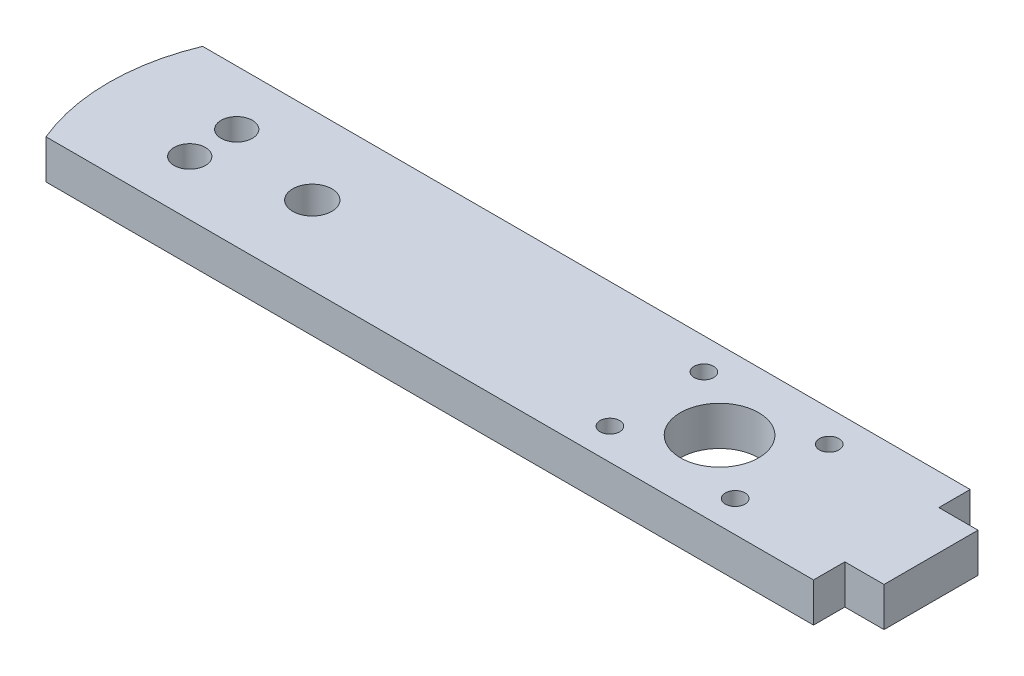
ISO-10303-21;
HEADER;
FILE_DESCRIPTION(('STEP AP214'),'2;1');
FILE_NAME('part.step','',(''),(''),'','','');
FILE_SCHEMA(('AUTOMOTIVE_DESIGN { 1 0 10303 214 1 1 1 1 }'));
ENDSEC;
DATA;
#1=APPLICATION_CONTEXT('core data for automotive mechanical design processes');
#2=APPLICATION_PROTOCOL_DEFINITION('international standard','automotive_design',2000,#1);
#3=PRODUCT_CONTEXT('',#1,'mechanical');
#4=PRODUCT('Part','Part','',(#3));
#5=PRODUCT_RELATED_PRODUCT_CATEGORY('part','',(#4));
#6=PRODUCT_DEFINITION_FORMATION('','',#4);
#7=PRODUCT_DEFINITION_CONTEXT('part definition',#1,'design');
#8=PRODUCT_DEFINITION('design','',#6,#7);
#9=PRODUCT_DEFINITION_SHAPE('','',#8);
#10=(LENGTH_UNIT() NAMED_UNIT(*) SI_UNIT(.MILLI.,.METRE.));
#11=(NAMED_UNIT(*) PLANE_ANGLE_UNIT() SI_UNIT($,.RADIAN.));
#12=(NAMED_UNIT(*) SI_UNIT($,.STERADIAN.) SOLID_ANGLE_UNIT());
#13=UNCERTAINTY_MEASURE_WITH_UNIT(LENGTH_MEASURE(1.E-05),#10,'distance_accuracy_value','');
#14=(GEOMETRIC_REPRESENTATION_CONTEXT(3) GLOBAL_UNCERTAINTY_ASSIGNED_CONTEXT((#13)) GLOBAL_UNIT_ASSIGNED_CONTEXT((#10,
#11,#12)) REPRESENTATION_CONTEXT('',''));
#15=CARTESIAN_POINT('',(0.,0.,0.));
#16=DIRECTION('',(0.,0.,1.));
#17=DIRECTION('',(1.,0.,0.));
#18=AXIS2_PLACEMENT_3D('',#15,#16,#17);
#19=CARTESIAN_POINT('',(-70.,2.5,9.99999999999979));
#20=DIRECTION('',(0.,0.,-1.));
#21=DIRECTION('',(-1.,0.,0.));
#22=AXIS2_PLACEMENT_3D('',#19,#20,#21);
#23=PLANE('',#22);
#24=DIRECTION('',(0.,1.,0.));
#25=VECTOR('',#24,1.);
#26=CARTESIAN_POINT('',(-28.0000000000001,-7.5,9.99999999999979));
#27=LINE('',#26,#25);
#28=CARTESIAN_POINT('',(-28.0000000000001,-2.5,9.99999999999979));
#29=VERTEX_POINT('',#28);
#30=CARTESIAN_POINT('',(-28.0000000000001,2.5,9.99999999999979));
#31=VERTEX_POINT('',#30);
#32=EDGE_CURVE('E75',#29,#31,#27,.T.);
#33=ORIENTED_EDGE('',*,*,#32,.F.);
#34=DIRECTION('',(1.,0.,0.));
#35=VECTOR('',#34,1.);
#36=CARTESIAN_POINT('',(-70.,-2.5,9.99999999999979));
#37=LINE('',#36,#35);
#38=CARTESIAN_POINT('',(70.,-2.5,9.99999999999979));
#39=VERTEX_POINT('',#38);
#40=EDGE_CURVE('E146',#29,#39,#37,.T.);
#41=ORIENTED_EDGE('',*,*,#40,.T.);
#42=DIRECTION('',(0.,-1.,0.));
#43=VECTOR('',#42,1.);
#44=CARTESIAN_POINT('',(70.,2.5,9.99999999999979));
#45=LINE('',#44,#43);
#46=CARTESIAN_POINT('',(70.,2.5,9.99999999999979));
#47=VERTEX_POINT('',#46);
#48=EDGE_CURVE('E134',#47,#39,#45,.T.);
#49=ORIENTED_EDGE('',*,*,#48,.F.);
#50=DIRECTION('',(1.,0.,0.));
#51=VECTOR('',#50,1.);
#52=CARTESIAN_POINT('',(-70.,2.5,9.99999999999979));
#53=LINE('',#52,#51);
#54=EDGE_CURVE('E142',#31,#47,#53,.T.);
#55=ORIENTED_EDGE('',*,*,#54,.F.);
#56=EDGE_LOOP('',(#33,#41,#49,#55));
#57=FACE_BOUND('',#56,.T.);
#58=ADVANCED_FACE('F60',(#57),#23,.F.);
#59=CARTESIAN_POINT('',(-70.,2.5,-9.99999999999979));
#60=DIRECTION('',(0.,0.,-1.));
#61=DIRECTION('',(-1.,0.,0.));
#62=AXIS2_PLACEMENT_3D('',#59,#60,#61);
#63=PLANE('',#62);
#64=DIRECTION('',(1.,0.,0.));
#65=VECTOR('',#64,1.);
#66=CARTESIAN_POINT('',(-70.,-2.5,-9.99999999999979));
#67=LINE('',#66,#65);
#68=CARTESIAN_POINT('',(-28.0000000000001,-2.5,-9.99999999999979));
#69=VERTEX_POINT('',#68);
#70=CARTESIAN_POINT('',(70.,-2.5,-9.99999999999979));
#71=VERTEX_POINT('',#70);
#72=EDGE_CURVE('E135',#69,#71,#67,.T.);
#73=ORIENTED_EDGE('',*,*,#72,.F.);
#74=DIRECTION('',(0.,1.,0.));
#75=VECTOR('',#74,1.);
#76=CARTESIAN_POINT('',(-28.0000000000001,-7.5,-9.99999999999979));
#77=LINE('',#76,#75);
#78=CARTESIAN_POINT('',(-28.0000000000001,2.5,-9.99999999999979));
#79=VERTEX_POINT('',#78);
#80=EDGE_CURVE('E571',#69,#79,#77,.T.);
#81=ORIENTED_EDGE('',*,*,#80,.T.);
#82=DIRECTION('',(1.,0.,0.));
#83=VECTOR('',#82,1.);
#84=CARTESIAN_POINT('',(-70.,2.5,-9.99999999999979));
#85=LINE('',#84,#83);
#86=CARTESIAN_POINT('',(70.,2.5,-9.99999999999979));
#87=VERTEX_POINT('',#86);
#88=EDGE_CURVE('E149',#79,#87,#85,.T.);
#89=ORIENTED_EDGE('',*,*,#88,.T.);
#90=DIRECTION('',(0.,-1.,0.));
#91=VECTOR('',#90,1.);
#92=CARTESIAN_POINT('',(70.,2.5,-9.99999999999979));
#93=LINE('',#92,#91);
#94=EDGE_CURVE('E152',#87,#71,#93,.T.);
#95=ORIENTED_EDGE('',*,*,#94,.T.);
#96=EDGE_LOOP('',(#73,#81,#89,#95));
#97=FACE_BOUND('',#96,.T.);
#98=ADVANCED_FACE('F189',(#97),#63,.T.);
#99=CARTESIAN_POINT('',(0.,-2.5,0.));
#100=DIRECTION('',(0.,-1.,0.));
#101=DIRECTION('',(0.,0.,-1.));
#102=AXIS2_PLACEMENT_3D('',#99,#100,#101);
#103=PLANE('',#102);
#104=CARTESIAN_POINT('',(-16.6491106406735,-2.5,3.));
#105=DIRECTION('',(0.,1.,0.));
#106=DIRECTION('',(0.,0.,1.));
#107=AXIS2_PLACEMENT_3D('',#104,#105,#106);
#108=CIRCLE('',#107,1.5);
#109=CARTESIAN_POINT('',(-16.6491106406735,-2.5,4.5));
#110=VERTEX_POINT('',#109);
#111=EDGE_CURVE('E470',#110,#110,#108,.T.);
#112=ORIENTED_EDGE('',*,*,#111,.T.);
#113=EDGE_LOOP('',(#112));
#114=FACE_BOUND('',#113,.T.);
#115=CARTESIAN_POINT('',(-16.6491106406735,-2.5,-3.));
#116=DIRECTION('',(0.,1.,0.));
#117=DIRECTION('',(0.,0.,1.));
#118=AXIS2_PLACEMENT_3D('',#115,#116,#117);
#119=CIRCLE('',#118,1.5);
#120=CARTESIAN_POINT('',(-16.6491106406735,-2.5,-1.5));
#121=VERTEX_POINT('',#120);
#122=EDGE_CURVE('E482',#121,#121,#119,.T.);
#123=ORIENTED_EDGE('',*,*,#122,.T.);
#124=EDGE_LOOP('',(#123));
#125=FACE_BOUND('',#124,.T.);
#126=CARTESIAN_POINT('',(-3.99999999999999,-2.5,0.));
#127=DIRECTION('',(0.,-1.,0.));
#128=DIRECTION('',(0.,0.,-1.));
#129=AXIS2_PLACEMENT_3D('',#126,#127,#128);
#130=CIRCLE('',#129,2.49999999999999);
#131=CARTESIAN_POINT('',(-3.99999999999999,-2.5,-2.49999999999999));
#132=VERTEX_POINT('',#131);
#133=EDGE_CURVE('E485',#132,#132,#130,.T.);
#134=ORIENTED_EDGE('',*,*,#133,.F.);
#135=EDGE_LOOP('',(#134));
#136=FACE_BOUND('',#135,.T.);
#137=CARTESIAN_POINT('',(56.,-2.5,-5.99999999999998));
#138=DIRECTION('',(0.,-1.,0.));
#139=DIRECTION('',(0.,0.,-1.));
#140=AXIS2_PLACEMENT_3D('',#137,#138,#139);
#141=CIRCLE('',#140,1.525);
#142=CARTESIAN_POINT('',(56.,-2.5,-7.52499999999998));
#143=VERTEX_POINT('',#142);
#144=EDGE_CURVE('E491',#143,#143,#141,.T.);
#145=ORIENTED_EDGE('',*,*,#144,.F.);
#146=EDGE_LOOP('',(#145));
#147=FACE_BOUND('',#146,.T.);
#148=CARTESIAN_POINT('',(40.,-2.5,-5.99999999999998));
#149=DIRECTION('',(0.,-1.,0.));
#150=DIRECTION('',(0.,0.,-1.));
#151=AXIS2_PLACEMENT_3D('',#148,#149,#150);
#152=CIRCLE('',#151,1.525);
#153=CARTESIAN_POINT('',(40.,-2.5,-7.52499999999998));
#154=VERTEX_POINT('',#153);
#155=EDGE_CURVE('E500',#154,#154,#152,.T.);
#156=ORIENTED_EDGE('',*,*,#155,.F.);
#157=EDGE_LOOP('',(#156));
#158=FACE_BOUND('',#157,.T.);
#159=CARTESIAN_POINT('',(40.,-2.5,5.99999999999998));
#160=DIRECTION('',(0.,-1.,0.));
#161=DIRECTION('',(0.,0.,-1.));
#162=AXIS2_PLACEMENT_3D('',#159,#160,#161);
#163=CIRCLE('',#162,1.525);
#164=CARTESIAN_POINT('',(40.,-2.5,4.47499999999999));
#165=VERTEX_POINT('',#164);
#166=EDGE_CURVE('E509',#165,#165,#163,.T.);
#167=ORIENTED_EDGE('',*,*,#166,.F.);
#168=EDGE_LOOP('',(#167));
#169=FACE_BOUND('',#168,.T.);
#170=CARTESIAN_POINT('',(56.,-2.5,5.99999999999998));
#171=DIRECTION('',(0.,-1.,0.));
#172=DIRECTION('',(0.,0.,-1.));
#173=AXIS2_PLACEMENT_3D('',#170,#171,#172);
#174=CIRCLE('',#173,1.525);
#175=CARTESIAN_POINT('',(56.,-2.5,4.47499999999999));
#176=VERTEX_POINT('',#175);
#177=EDGE_CURVE('E518',#176,#176,#174,.T.);
#178=ORIENTED_EDGE('',*,*,#177,.F.);
#179=EDGE_LOOP('',(#178));
#180=FACE_BOUND('',#179,.T.);
#181=CARTESIAN_POINT('',(48.,-2.5,0.));
#182=DIRECTION('',(0.,-1.,0.));
#183=DIRECTION('',(0.,0.,-1.));
#184=AXIS2_PLACEMENT_3D('',#181,#182,#183);
#185=CIRCLE('',#184,5.);
#186=CARTESIAN_POINT('',(48.,-2.5,-5.));
#187=VERTEX_POINT('',#186);
#188=EDGE_CURVE('E159',#187,#187,#185,.T.);
#189=ORIENTED_EDGE('',*,*,#188,.F.);
#190=EDGE_LOOP('',(#189));
#191=FACE_BOUND('',#190,.T.);
#192=ORIENTED_EDGE('',*,*,#40,.F.);
#193=CARTESIAN_POINT('',(-3.99999999999999,-2.5,0.));
#194=DIRECTION('',(0.,-1.,0.));
#195=DIRECTION('',(0.,0.,-1.));
#196=AXIS2_PLACEMENT_3D('',#193,#194,#195);
#197=CIRCLE('',#196,26.);
#198=EDGE_CURVE('E461',#29,#69,#197,.T.);
#199=ORIENTED_EDGE('',*,*,#198,.T.);
#200=ORIENTED_EDGE('',*,*,#72,.T.);
#201=DIRECTION('',(0.,0.,-1.));
#202=VECTOR('',#201,1.);
#203=CARTESIAN_POINT('',(70.,-2.5,9.99999999999979));
#204=LINE('',#203,#202);
#205=CARTESIAN_POINT('',(70.,-2.5,-5.99999999999998));
#206=VERTEX_POINT('',#205);
#207=EDGE_CURVE('E127',#206,#71,#204,.T.);
#208=ORIENTED_EDGE('',*,*,#207,.F.);
#209=DIRECTION('',(1.,0.,0.));
#210=VECTOR('',#209,1.);
#211=CARTESIAN_POINT('',(70.,-2.5,-5.99999999999998));
#212=LINE('',#211,#210);
#213=CARTESIAN_POINT('',(75.,-2.5,-6.00000000000001));
#214=VERTEX_POINT('',#213);
#215=EDGE_CURVE('E106',#206,#214,#212,.T.);
#216=ORIENTED_EDGE('',*,*,#215,.T.);
#217=DIRECTION('',(0.,0.,1.));
#218=VECTOR('',#217,1.);
#219=CARTESIAN_POINT('',(75.,-2.5,-6.00000000000001));
#220=LINE('',#219,#218);
#221=CARTESIAN_POINT('',(75.,-2.5,5.99999999999998));
#222=VERTEX_POINT('',#221);
#223=EDGE_CURVE('E115',#214,#222,#220,.T.);
#224=ORIENTED_EDGE('',*,*,#223,.T.);
#225=DIRECTION('',(1.,0.,0.));
#226=VECTOR('',#225,1.);
#227=CARTESIAN_POINT('',(70.,-2.5,5.99999999999998));
#228=LINE('',#227,#226);
#229=CARTESIAN_POINT('',(70.,-2.5,5.99999999999998));
#230=VERTEX_POINT('',#229);
#231=EDGE_CURVE('E121',#230,#222,#228,.T.);
#232=ORIENTED_EDGE('',*,*,#231,.F.);
#233=EDGE_CURVE('E139',#39,#230,#204,.T.);
#234=ORIENTED_EDGE('',*,*,#233,.F.);
#235=EDGE_LOOP('',(#192,#199,#200,#208,#216,#224,#232,#234));
#236=FACE_BOUND('',#235,.T.);
#237=ADVANCED_FACE('F124',(#114,#125,#136,#147,#158,#169,#180,#191,#236),#103,.T.);
#238=CARTESIAN_POINT('',(0.,2.5,0.));
#239=DIRECTION('',(0.,-1.,0.));
#240=DIRECTION('',(0.,0.,-1.));
#241=AXIS2_PLACEMENT_3D('',#238,#239,#240);
#242=PLANE('',#241);
#243=CARTESIAN_POINT('',(48.,2.5,0.));
#244=DIRECTION('',(0.,-1.,0.));
#245=DIRECTION('',(0.,0.,-1.));
#246=AXIS2_PLACEMENT_3D('',#243,#244,#245);
#247=CIRCLE('',#246,5.);
#248=CARTESIAN_POINT('',(48.,2.5,-5.));
#249=VERTEX_POINT('',#248);
#250=EDGE_CURVE('E156',#249,#249,#247,.T.);
#251=ORIENTED_EDGE('',*,*,#250,.T.);
#252=EDGE_LOOP('',(#251));
#253=FACE_BOUND('',#252,.T.);
#254=CARTESIAN_POINT('',(56.,2.5,5.99999999999998));
#255=DIRECTION('',(0.,-1.,0.));
#256=DIRECTION('',(0.,0.,-1.));
#257=AXIS2_PLACEMENT_3D('',#254,#255,#256);
#258=CIRCLE('',#257,1.24999999999999);
#259=CARTESIAN_POINT('',(56.,2.5,4.75));
#260=VERTEX_POINT('',#259);
#261=EDGE_CURVE('E164',#260,#260,#258,.T.);
#262=ORIENTED_EDGE('',*,*,#261,.T.);
#263=EDGE_LOOP('',(#262));
#264=FACE_BOUND('',#263,.T.);
#265=CARTESIAN_POINT('',(40.,2.5,5.99999999999998));
#266=DIRECTION('',(0.,-1.,0.));
#267=DIRECTION('',(0.,0.,-1.));
#268=AXIS2_PLACEMENT_3D('',#265,#266,#267);
#269=CIRCLE('',#268,1.24999999999999);
#270=CARTESIAN_POINT('',(40.,2.5,4.75));
#271=VERTEX_POINT('',#270);
#272=EDGE_CURVE('E515',#271,#271,#269,.T.);
#273=ORIENTED_EDGE('',*,*,#272,.T.);
#274=EDGE_LOOP('',(#273));
#275=FACE_BOUND('',#274,.T.);
#276=CARTESIAN_POINT('',(40.,2.5,-5.99999999999998));
#277=DIRECTION('',(0.,-1.,0.));
#278=DIRECTION('',(0.,0.,-1.));
#279=AXIS2_PLACEMENT_3D('',#276,#277,#278);
#280=CIRCLE('',#279,1.24999999999999);
#281=CARTESIAN_POINT('',(40.,2.5,-7.24999999999997));
#282=VERTEX_POINT('',#281);
#283=EDGE_CURVE('E506',#282,#282,#280,.T.);
#284=ORIENTED_EDGE('',*,*,#283,.T.);
#285=EDGE_LOOP('',(#284));
#286=FACE_BOUND('',#285,.T.);
#287=CARTESIAN_POINT('',(56.,2.5,-5.99999999999998));
#288=DIRECTION('',(0.,-1.,0.));
#289=DIRECTION('',(0.,0.,-1.));
#290=AXIS2_PLACEMENT_3D('',#287,#288,#289);
#291=CIRCLE('',#290,1.24999999999999);
#292=CARTESIAN_POINT('',(56.,2.5,-7.24999999999997));
#293=VERTEX_POINT('',#292);
#294=EDGE_CURVE('E497',#293,#293,#291,.T.);
#295=ORIENTED_EDGE('',*,*,#294,.T.);
#296=EDGE_LOOP('',(#295));
#297=FACE_BOUND('',#296,.T.);
#298=CARTESIAN_POINT('',(-3.99999999999999,2.5,0.));
#299=DIRECTION('',(0.,-1.,0.));
#300=DIRECTION('',(0.,0.,-1.));
#301=AXIS2_PLACEMENT_3D('',#298,#299,#300);
#302=CIRCLE('',#301,2.49999999999999);
#303=CARTESIAN_POINT('',(-3.99999999999999,2.5,-2.49999999999999));
#304=VERTEX_POINT('',#303);
#305=EDGE_CURVE('E488',#304,#304,#302,.T.);
#306=ORIENTED_EDGE('',*,*,#305,.T.);
#307=EDGE_LOOP('',(#306));
#308=FACE_BOUND('',#307,.T.);
#309=CARTESIAN_POINT('',(-16.6491106406735,2.5,-3.));
#310=DIRECTION('',(0.,1.,0.));
#311=DIRECTION('',(0.,0.,1.));
#312=AXIS2_PLACEMENT_3D('',#309,#310,#311);
#313=CIRCLE('',#312,1.99999999999999);
#314=CARTESIAN_POINT('',(-16.6491106406735,2.5,-1.00000000000001));
#315=VERTEX_POINT('',#314);
#316=EDGE_CURVE('E473',#315,#315,#313,.T.);
#317=ORIENTED_EDGE('',*,*,#316,.F.);
#318=EDGE_LOOP('',(#317));
#319=FACE_BOUND('',#318,.T.);
#320=CARTESIAN_POINT('',(-16.6491106406735,2.5,3.));
#321=DIRECTION('',(0.,1.,0.));
#322=DIRECTION('',(0.,0.,1.));
#323=AXIS2_PLACEMENT_3D('',#320,#321,#322);
#324=CIRCLE('',#323,1.99999999999999);
#325=CARTESIAN_POINT('',(-16.6491106406735,2.5,4.99999999999999));
#326=VERTEX_POINT('',#325);
#327=EDGE_CURVE('E459',#326,#326,#324,.T.);
#328=ORIENTED_EDGE('',*,*,#327,.F.);
#329=EDGE_LOOP('',(#328));
#330=FACE_BOUND('',#329,.T.);
#331=CARTESIAN_POINT('',(-3.99999999999999,2.5,0.));
#332=DIRECTION('',(0.,1.,0.));
#333=DIRECTION('',(0.,0.,1.));
#334=AXIS2_PLACEMENT_3D('',#331,#332,#333);
#335=CIRCLE('',#334,26.);
#336=EDGE_CURVE('E200',#79,#31,#335,.T.);
#337=ORIENTED_EDGE('',*,*,#336,.T.);
#338=ORIENTED_EDGE('',*,*,#54,.T.);
#339=DIRECTION('',(0.,0.,-1.));
#340=VECTOR('',#339,1.);
#341=CARTESIAN_POINT('',(70.,2.5,9.99999999999979));
#342=LINE('',#341,#340);
#343=CARTESIAN_POINT('',(70.,2.5,5.99999999999998));
#344=VERTEX_POINT('',#343);
#345=EDGE_CURVE('E171',#47,#344,#342,.T.);
#346=ORIENTED_EDGE('',*,*,#345,.T.);
#347=DIRECTION('',(1.,0.,0.));
#348=VECTOR('',#347,1.);
#349=CARTESIAN_POINT('',(70.,2.5,5.99999999999998));
#350=LINE('',#349,#348);
#351=CARTESIAN_POINT('',(75.,2.5,5.99999999999998));
#352=VERTEX_POINT('',#351);
#353=EDGE_CURVE('E128',#344,#352,#350,.T.);
#354=ORIENTED_EDGE('',*,*,#353,.T.);
#355=DIRECTION('',(0.,0.,1.));
#356=VECTOR('',#355,1.);
#357=CARTESIAN_POINT('',(75.,2.5,-6.00000000000001));
#358=LINE('',#357,#356);
#359=CARTESIAN_POINT('',(75.,2.5,-6.00000000000001));
#360=VERTEX_POINT('',#359);
#361=EDGE_CURVE('E130',#360,#352,#358,.T.);
#362=ORIENTED_EDGE('',*,*,#361,.F.);
#363=DIRECTION('',(1.,0.,0.));
#364=VECTOR('',#363,1.);
#365=CARTESIAN_POINT('',(70.,2.5,-5.99999999999998));
#366=LINE('',#365,#364);
#367=CARTESIAN_POINT('',(70.,2.5,-5.99999999999998));
#368=VERTEX_POINT('',#367);
#369=EDGE_CURVE('E108',#368,#360,#366,.T.);
#370=ORIENTED_EDGE('',*,*,#369,.F.);
#371=EDGE_CURVE('E170',#368,#87,#342,.T.);
#372=ORIENTED_EDGE('',*,*,#371,.T.);
#373=ORIENTED_EDGE('',*,*,#88,.F.);
#374=EDGE_LOOP('',(#337,#338,#346,#354,#362,#370,#372,#373));
#375=FACE_BOUND('',#374,.T.);
#376=ADVANCED_FACE('F181',(#253,#264,#275,#286,#297,#308,#319,#330,#375),#242,.F.);
#377=CARTESIAN_POINT('',(70.,2.5,9.99999999999979));
#378=DIRECTION('',(-1.,0.,0.));
#379=DIRECTION('',(0.,0.,1.));
#380=AXIS2_PLACEMENT_3D('',#377,#378,#379);
#381=PLANE('',#380);
#382=ORIENTED_EDGE('',*,*,#371,.F.);
#383=DIRECTION('',(0.,-1.,0.));
#384=VECTOR('',#383,1.);
#385=CARTESIAN_POINT('',(70.,2.5,-5.99999999999998));
#386=LINE('',#385,#384);
#387=EDGE_CURVE('E68',#368,#206,#386,.T.);
#388=ORIENTED_EDGE('',*,*,#387,.T.);
#389=ORIENTED_EDGE('',*,*,#207,.T.);
#390=ORIENTED_EDGE('',*,*,#94,.F.);
#391=EDGE_LOOP('',(#382,#388,#389,#390));
#392=FACE_BOUND('',#391,.T.);
#393=ADVANCED_FACE('F187',(#392),#381,.F.);
#394=DIRECTION('',(0.,-1.,0.));
#395=VECTOR('',#394,1.);
#396=CARTESIAN_POINT('',(70.,2.5,5.99999999999998));
#397=LINE('',#396,#395);
#398=EDGE_CURVE('E12',#344,#230,#397,.T.);
#399=ORIENTED_EDGE('',*,*,#398,.F.);
#400=ORIENTED_EDGE('',*,*,#345,.F.);
#401=ORIENTED_EDGE('',*,*,#48,.T.);
#402=ORIENTED_EDGE('',*,*,#233,.T.);
#403=EDGE_LOOP('',(#399,#400,#401,#402));
#404=FACE_BOUND('',#403,.T.);
#405=ADVANCED_FACE('F204',(#404),#381,.F.);
#406=CARTESIAN_POINT('',(75.,2.5,-6.00000000000001));
#407=DIRECTION('',(1.,0.,0.));
#408=DIRECTION('',(0.,0.,-1.));
#409=AXIS2_PLACEMENT_3D('',#406,#407,#408);
#410=PLANE('',#409);
#411=ORIENTED_EDGE('',*,*,#223,.F.);
#412=DIRECTION('',(0.,-1.,0.));
#413=VECTOR('',#412,1.);
#414=CARTESIAN_POINT('',(75.,2.5,-6.00000000000001));
#415=LINE('',#414,#413);
#416=EDGE_CURVE('E102',#360,#214,#415,.T.);
#417=ORIENTED_EDGE('',*,*,#416,.F.);
#418=ORIENTED_EDGE('',*,*,#361,.T.);
#419=DIRECTION('',(0.,-1.,0.));
#420=VECTOR('',#419,1.);
#421=CARTESIAN_POINT('',(75.,2.5,5.99999999999998));
#422=LINE('',#421,#420);
#423=EDGE_CURVE('E112',#352,#222,#422,.T.);
#424=ORIENTED_EDGE('',*,*,#423,.T.);
#425=EDGE_LOOP('',(#411,#417,#418,#424));
#426=FACE_BOUND('',#425,.T.);
#427=ADVANCED_FACE('F116',(#426),#410,.T.);
#428=CARTESIAN_POINT('',(70.,2.5,-5.99999999999998));
#429=DIRECTION('',(0.,0.,-1.));
#430=DIRECTION('',(-1.,0.,0.));
#431=AXIS2_PLACEMENT_3D('',#428,#429,#430);
#432=PLANE('',#431);
#433=ORIENTED_EDGE('',*,*,#215,.F.);
#434=ORIENTED_EDGE('',*,*,#387,.F.);
#435=ORIENTED_EDGE('',*,*,#369,.T.);
#436=ORIENTED_EDGE('',*,*,#416,.T.);
#437=EDGE_LOOP('',(#433,#434,#435,#436));
#438=FACE_BOUND('',#437,.T.);
#439=ADVANCED_FACE('F104',(#438),#432,.T.);
#440=CARTESIAN_POINT('',(70.,2.5,5.99999999999998));
#441=DIRECTION('',(0.,0.,-1.));
#442=DIRECTION('',(-1.,0.,0.));
#443=AXIS2_PLACEMENT_3D('',#440,#441,#442);
#444=PLANE('',#443);
#445=ORIENTED_EDGE('',*,*,#231,.T.);
#446=ORIENTED_EDGE('',*,*,#423,.F.);
#447=ORIENTED_EDGE('',*,*,#353,.F.);
#448=ORIENTED_EDGE('',*,*,#398,.T.);
#449=EDGE_LOOP('',(#445,#446,#447,#448));
#450=FACE_BOUND('',#449,.T.);
#451=ADVANCED_FACE('F62',(#450),#444,.F.);
#452=CARTESIAN_POINT('',(48.,2.5,0.));
#453=DIRECTION('',(0.,-1.,0.));
#454=DIRECTION('',(0.,0.,-1.));
#455=AXIS2_PLACEMENT_3D('',#452,#453,#454);
#456=CYLINDRICAL_SURFACE('',#455,5.);
#457=ORIENTED_EDGE('',*,*,#250,.F.);
#458=EDGE_LOOP('',(#457));
#459=FACE_BOUND('',#458,.T.);
#460=ORIENTED_EDGE('',*,*,#188,.T.);
#461=EDGE_LOOP('',(#460));
#462=FACE_BOUND('',#461,.T.);
#463=ADVANCED_FACE('F206',(#459,#462),#456,.F.);
#464=CARTESIAN_POINT('',(56.,-2.5,5.99999999999998));
#465=DIRECTION('',(0.,-1.,0.));
#466=DIRECTION('',(0.,0.,-1.));
#467=AXIS2_PLACEMENT_3D('',#464,#465,#466);
#468=CYLINDRICAL_SURFACE('',#467,1.24999999999999);
#469=ORIENTED_EDGE('',*,*,#261,.F.);
#470=EDGE_LOOP('',(#469));
#471=FACE_BOUND('',#470,.T.);
#472=CARTESIAN_POINT('',(56.,-2.22499999999999,5.99999999999998));
#473=DIRECTION('',(0.,-1.,0.));
#474=DIRECTION('',(0.,0.,-1.));
#475=AXIS2_PLACEMENT_3D('',#472,#473,#474);
#476=CIRCLE('',#475,1.24999999999999);
#477=CARTESIAN_POINT('',(56.,-2.22499999999999,4.75));
#478=VERTEX_POINT('',#477);
#479=EDGE_CURVE('E520',#478,#478,#476,.T.);
#480=ORIENTED_EDGE('',*,*,#479,.T.);
#481=EDGE_LOOP('',(#480));
#482=FACE_BOUND('',#481,.T.);
#483=ADVANCED_FACE('F211',(#471,#482),#468,.F.);
#484=CARTESIAN_POINT('',(56.,-2.5,5.99999999999998));
#485=DIRECTION('',(0.,-1.,0.));
#486=DIRECTION('',(0.,0.,-1.));
#487=AXIS2_PLACEMENT_3D('',#484,#485,#486);
#488=CONICAL_SURFACE('',#487,1.525,0.785398163397445);
#489=ORIENTED_EDGE('',*,*,#479,.F.);
#490=EDGE_LOOP('',(#489));
#491=FACE_BOUND('',#490,.T.);
#492=ORIENTED_EDGE('',*,*,#177,.T.);
#493=EDGE_LOOP('',(#492));
#494=FACE_BOUND('',#493,.T.);
#495=ADVANCED_FACE('F238',(#491,#494),#488,.F.);
#496=CARTESIAN_POINT('',(40.,-2.5,5.99999999999998));
#497=DIRECTION('',(0.,-1.,0.));
#498=DIRECTION('',(0.,0.,-1.));
#499=AXIS2_PLACEMENT_3D('',#496,#497,#498);
#500=CYLINDRICAL_SURFACE('',#499,1.24999999999999);
#501=ORIENTED_EDGE('',*,*,#272,.F.);
#502=EDGE_LOOP('',(#501));
#503=FACE_BOUND('',#502,.T.);
#504=CARTESIAN_POINT('',(40.,-2.22499999999999,5.99999999999998));
#505=DIRECTION('',(0.,-1.,0.));
#506=DIRECTION('',(0.,0.,-1.));
#507=AXIS2_PLACEMENT_3D('',#504,#505,#506);
#508=CIRCLE('',#507,1.24999999999999);
#509=CARTESIAN_POINT('',(40.,-2.22499999999999,4.75));
#510=VERTEX_POINT('',#509);
#511=EDGE_CURVE('E512',#510,#510,#508,.T.);
#512=ORIENTED_EDGE('',*,*,#511,.T.);
#513=EDGE_LOOP('',(#512));
#514=FACE_BOUND('',#513,.T.);
#515=ADVANCED_FACE('F242',(#503,#514),#500,.F.);
#516=CARTESIAN_POINT('',(40.,-2.5,5.99999999999998));
#517=DIRECTION('',(0.,-1.,0.));
#518=DIRECTION('',(0.,0.,-1.));
#519=AXIS2_PLACEMENT_3D('',#516,#517,#518);
#520=CONICAL_SURFACE('',#519,1.525,0.785398163397445);
#521=ORIENTED_EDGE('',*,*,#511,.F.);
#522=EDGE_LOOP('',(#521));
#523=FACE_BOUND('',#522,.T.);
#524=ORIENTED_EDGE('',*,*,#166,.T.);
#525=EDGE_LOOP('',(#524));
#526=FACE_BOUND('',#525,.T.);
#527=ADVANCED_FACE('F246',(#523,#526),#520,.F.);
#528=CARTESIAN_POINT('',(40.,-2.5,-5.99999999999998));
#529=DIRECTION('',(0.,-1.,0.));
#530=DIRECTION('',(0.,0.,-1.));
#531=AXIS2_PLACEMENT_3D('',#528,#529,#530);
#532=CYLINDRICAL_SURFACE('',#531,1.24999999999999);
#533=ORIENTED_EDGE('',*,*,#283,.F.);
#534=EDGE_LOOP('',(#533));
#535=FACE_BOUND('',#534,.T.);
#536=CARTESIAN_POINT('',(40.,-2.22499999999999,-5.99999999999998));
#537=DIRECTION('',(0.,-1.,0.));
#538=DIRECTION('',(0.,0.,-1.));
#539=AXIS2_PLACEMENT_3D('',#536,#537,#538);
#540=CIRCLE('',#539,1.24999999999999);
#541=CARTESIAN_POINT('',(40.,-2.22499999999999,-7.24999999999997));
#542=VERTEX_POINT('',#541);
#543=EDGE_CURVE('E503',#542,#542,#540,.T.);
#544=ORIENTED_EDGE('',*,*,#543,.T.);
#545=EDGE_LOOP('',(#544));
#546=FACE_BOUND('',#545,.T.);
#547=ADVANCED_FACE('F250',(#535,#546),#532,.F.);
#548=CARTESIAN_POINT('',(40.,-2.5,-5.99999999999998));
#549=DIRECTION('',(0.,-1.,0.));
#550=DIRECTION('',(0.,0.,-1.));
#551=AXIS2_PLACEMENT_3D('',#548,#549,#550);
#552=CONICAL_SURFACE('',#551,1.525,0.785398163397445);
#553=ORIENTED_EDGE('',*,*,#543,.F.);
#554=EDGE_LOOP('',(#553));
#555=FACE_BOUND('',#554,.T.);
#556=ORIENTED_EDGE('',*,*,#155,.T.);
#557=EDGE_LOOP('',(#556));
#558=FACE_BOUND('',#557,.T.);
#559=ADVANCED_FACE('F254',(#555,#558),#552,.F.);
#560=CARTESIAN_POINT('',(56.,-2.5,-5.99999999999998));
#561=DIRECTION('',(0.,-1.,0.));
#562=DIRECTION('',(0.,0.,-1.));
#563=AXIS2_PLACEMENT_3D('',#560,#561,#562);
#564=CYLINDRICAL_SURFACE('',#563,1.24999999999999);
#565=ORIENTED_EDGE('',*,*,#294,.F.);
#566=EDGE_LOOP('',(#565));
#567=FACE_BOUND('',#566,.T.);
#568=CARTESIAN_POINT('',(56.,-2.22499999999999,-5.99999999999998));
#569=DIRECTION('',(0.,-1.,0.));
#570=DIRECTION('',(0.,0.,-1.));
#571=AXIS2_PLACEMENT_3D('',#568,#569,#570);
#572=CIRCLE('',#571,1.24999999999999);
#573=CARTESIAN_POINT('',(56.,-2.22499999999999,-7.24999999999997));
#574=VERTEX_POINT('',#573);
#575=EDGE_CURVE('E494',#574,#574,#572,.T.);
#576=ORIENTED_EDGE('',*,*,#575,.T.);
#577=EDGE_LOOP('',(#576));
#578=FACE_BOUND('',#577,.T.);
#579=ADVANCED_FACE('F258',(#567,#578),#564,.F.);
#580=CARTESIAN_POINT('',(56.,-2.5,-5.99999999999998));
#581=DIRECTION('',(0.,-1.,0.));
#582=DIRECTION('',(0.,0.,-1.));
#583=AXIS2_PLACEMENT_3D('',#580,#581,#582);
#584=CONICAL_SURFACE('',#583,1.525,0.785398163397445);
#585=ORIENTED_EDGE('',*,*,#575,.F.);
#586=EDGE_LOOP('',(#585));
#587=FACE_BOUND('',#586,.T.);
#588=ORIENTED_EDGE('',*,*,#144,.T.);
#589=EDGE_LOOP('',(#588));
#590=FACE_BOUND('',#589,.T.);
#591=ADVANCED_FACE('F262',(#587,#590),#584,.F.);
#592=CARTESIAN_POINT('',(-3.99999999999999,-2.5,0.));
#593=DIRECTION('',(0.,-1.,0.));
#594=DIRECTION('',(0.,0.,-1.));
#595=AXIS2_PLACEMENT_3D('',#592,#593,#594);
#596=CYLINDRICAL_SURFACE('',#595,2.49999999999999);
#597=ORIENTED_EDGE('',*,*,#305,.F.);
#598=EDGE_LOOP('',(#597));
#599=FACE_BOUND('',#598,.T.);
#600=ORIENTED_EDGE('',*,*,#133,.T.);
#601=EDGE_LOOP('',(#600));
#602=FACE_BOUND('',#601,.T.);
#603=ADVANCED_FACE('F266',(#599,#602),#596,.F.);
#604=CARTESIAN_POINT('',(-16.6491106406735,2.5,-3.));
#605=DIRECTION('',(0.,1.,0.));
#606=DIRECTION('',(0.,0.,1.));
#607=AXIS2_PLACEMENT_3D('',#604,#605,#606);
#608=CYLINDRICAL_SURFACE('',#607,1.5);
#609=ORIENTED_EDGE('',*,*,#122,.F.);
#610=EDGE_LOOP('',(#609));
#611=FACE_BOUND('',#610,.T.);
#612=CARTESIAN_POINT('',(-16.6491106406735,-0.499999999999999,-3.));
#613=DIRECTION('',(0.,1.,0.));
#614=DIRECTION('',(0.,0.,1.));
#615=AXIS2_PLACEMENT_3D('',#612,#613,#614);
#616=CIRCLE('',#615,1.50000000000001);
#617=CARTESIAN_POINT('',(-16.6491106406735,-0.499999999999999,-1.49999999999999));
#618=VERTEX_POINT('',#617);
#619=EDGE_CURVE('E479',#618,#618,#616,.T.);
#620=ORIENTED_EDGE('',*,*,#619,.T.);
#621=EDGE_LOOP('',(#620));
#622=FACE_BOUND('',#621,.T.);
#623=ADVANCED_FACE('F270',(#611,#622),#608,.F.);
#624=CARTESIAN_POINT('',(-15.1491106406735,-0.499999999999999,-3.));
#625=DIRECTION('',(0.,-1.,0.));
#626=DIRECTION('',(0.,0.,-1.));
#627=AXIS2_PLACEMENT_3D('',#624,#625,#626);
#628=PLANE('',#627);
#629=ORIENTED_EDGE('',*,*,#619,.F.);
#630=EDGE_LOOP('',(#629));
#631=FACE_BOUND('',#630,.T.);
#632=CARTESIAN_POINT('',(-16.6491106406735,-0.499999999999999,-3.));
#633=DIRECTION('',(0.,1.,0.));
#634=DIRECTION('',(0.,0.,1.));
#635=AXIS2_PLACEMENT_3D('',#632,#633,#634);
#636=CIRCLE('',#635,1.99999999999999);
#637=CARTESIAN_POINT('',(-16.6491106406735,-0.499999999999999,-1.00000000000001));
#638=VERTEX_POINT('',#637);
#639=EDGE_CURVE('E476',#638,#638,#636,.T.);
#640=ORIENTED_EDGE('',*,*,#639,.T.);
#641=EDGE_LOOP('',(#640));
#642=FACE_BOUND('',#641,.T.);
#643=ADVANCED_FACE('F274',(#631,#642),#628,.F.);
#644=CARTESIAN_POINT('',(-16.6491106406735,2.5,-3.));
#645=DIRECTION('',(0.,1.,0.));
#646=DIRECTION('',(0.,0.,1.));
#647=AXIS2_PLACEMENT_3D('',#644,#645,#646);
#648=CYLINDRICAL_SURFACE('',#647,1.99999999999999);
#649=ORIENTED_EDGE('',*,*,#639,.F.);
#650=EDGE_LOOP('',(#649));
#651=FACE_BOUND('',#650,.T.);
#652=ORIENTED_EDGE('',*,*,#316,.T.);
#653=EDGE_LOOP('',(#652));
#654=FACE_BOUND('',#653,.T.);
#655=ADVANCED_FACE('F278',(#651,#654),#648,.F.);
#656=CARTESIAN_POINT('',(-16.6491106406735,2.5,3.));
#657=DIRECTION('',(0.,1.,0.));
#658=DIRECTION('',(0.,0.,1.));
#659=AXIS2_PLACEMENT_3D('',#656,#657,#658);
#660=CYLINDRICAL_SURFACE('',#659,1.5);
#661=ORIENTED_EDGE('',*,*,#111,.F.);
#662=EDGE_LOOP('',(#661));
#663=FACE_BOUND('',#662,.T.);
#664=CARTESIAN_POINT('',(-16.6491106406735,-0.499999999999999,3.));
#665=DIRECTION('',(0.,1.,0.));
#666=DIRECTION('',(0.,0.,1.));
#667=AXIS2_PLACEMENT_3D('',#664,#665,#666);
#668=CIRCLE('',#667,1.50000000000001);
#669=CARTESIAN_POINT('',(-16.6491106406735,-0.499999999999999,4.50000000000001));
#670=VERTEX_POINT('',#669);
#671=EDGE_CURVE('E463',#670,#670,#668,.T.);
#672=ORIENTED_EDGE('',*,*,#671,.T.);
#673=EDGE_LOOP('',(#672));
#674=FACE_BOUND('',#673,.T.);
#675=ADVANCED_FACE('F282',(#663,#674),#660,.F.);
#676=CARTESIAN_POINT('',(-15.1491106406735,-0.499999999999999,3.));
#677=DIRECTION('',(0.,-1.,0.));
#678=DIRECTION('',(0.,0.,-1.));
#679=AXIS2_PLACEMENT_3D('',#676,#677,#678);
#680=PLANE('',#679);
#681=ORIENTED_EDGE('',*,*,#671,.F.);
#682=EDGE_LOOP('',(#681));
#683=FACE_BOUND('',#682,.T.);
#684=CARTESIAN_POINT('',(-16.6491106406735,-0.499999999999999,3.));
#685=DIRECTION('',(0.,1.,0.));
#686=DIRECTION('',(0.,0.,1.));
#687=AXIS2_PLACEMENT_3D('',#684,#685,#686);
#688=CIRCLE('',#687,1.99999999999999);
#689=CARTESIAN_POINT('',(-16.6491106406735,-0.499999999999999,4.99999999999999));
#690=VERTEX_POINT('',#689);
#691=EDGE_CURVE('E456',#690,#690,#688,.T.);
#692=ORIENTED_EDGE('',*,*,#691,.T.);
#693=EDGE_LOOP('',(#692));
#694=FACE_BOUND('',#693,.T.);
#695=ADVANCED_FACE('F286',(#683,#694),#680,.F.);
#696=CARTESIAN_POINT('',(-16.6491106406735,2.5,3.));
#697=DIRECTION('',(0.,1.,0.));
#698=DIRECTION('',(0.,0.,1.));
#699=AXIS2_PLACEMENT_3D('',#696,#697,#698);
#700=CYLINDRICAL_SURFACE('',#699,1.99999999999999);
#701=ORIENTED_EDGE('',*,*,#691,.F.);
#702=EDGE_LOOP('',(#701));
#703=FACE_BOUND('',#702,.T.);
#704=ORIENTED_EDGE('',*,*,#327,.T.);
#705=EDGE_LOOP('',(#704));
#706=FACE_BOUND('',#705,.T.);
#707=ADVANCED_FACE('F290',(#703,#706),#700,.F.);
#708=CARTESIAN_POINT('',(-3.99999999999999,-7.5,0.));
#709=DIRECTION('',(0.,1.,0.));
#710=DIRECTION('',(0.,0.,1.));
#711=AXIS2_PLACEMENT_3D('',#708,#709,#710);
#712=CYLINDRICAL_SURFACE('',#711,26.);
#713=ORIENTED_EDGE('',*,*,#32,.T.);
#714=ORIENTED_EDGE('',*,*,#336,.F.);
#715=ORIENTED_EDGE('',*,*,#80,.F.);
#716=ORIENTED_EDGE('',*,*,#198,.F.);
#717=EDGE_LOOP('',(#713,#714,#715,#716));
#718=FACE_BOUND('',#717,.T.);
#719=ADVANCED_FACE('F294',(#718),#712,.T.);
#720=CLOSED_SHELL('',(#58,#98,#237,#376,#393,#405,#427,#439,#451,#463,#483,#495,#515,#527,#547,
#559,#579,#591,#603,#623,#643,#655,#675,#695,#707,#719));
#721=MANIFOLD_SOLID_BREP('B2',#720);
#722=ADVANCED_BREP_SHAPE_REPRESENTATION('',(#18,#721),#14);
#723=SHAPE_DEFINITION_REPRESENTATION(#9,#722);
ENDSEC;
END-ISO-10303-21;
